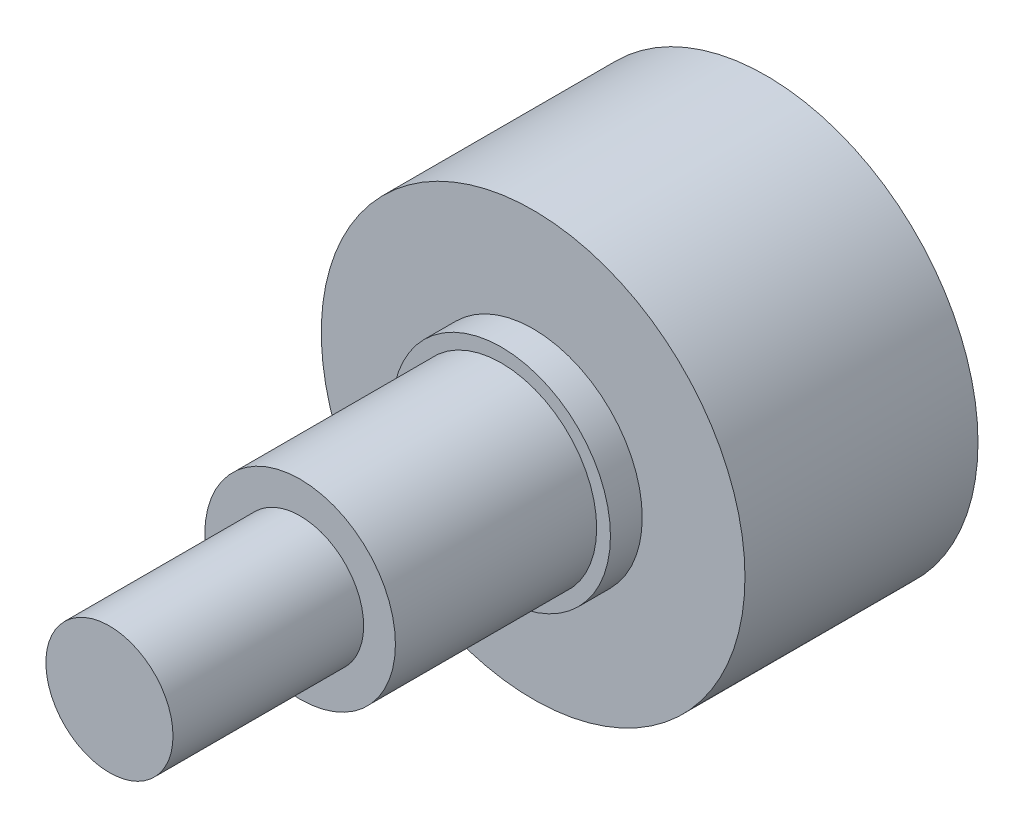
ISO-10303-21;
HEADER;
FILE_DESCRIPTION(('STEP AP214'),'2;1');
FILE_NAME('part.step','',(''),(''),'','','');
FILE_SCHEMA(('AUTOMOTIVE_DESIGN { 1 0 10303 214 1 1 1 1 }'));
ENDSEC;
DATA;
#1=APPLICATION_CONTEXT('core data for automotive mechanical design processes');
#2=APPLICATION_PROTOCOL_DEFINITION('international standard','automotive_design',2000,#1);
#3=PRODUCT_CONTEXT('',#1,'mechanical');
#4=PRODUCT('Part','Part','',(#3));
#5=PRODUCT_RELATED_PRODUCT_CATEGORY('part','',(#4));
#6=PRODUCT_DEFINITION_FORMATION('','',#4);
#7=PRODUCT_DEFINITION_CONTEXT('part definition',#1,'design');
#8=PRODUCT_DEFINITION('design','',#6,#7);
#9=PRODUCT_DEFINITION_SHAPE('','',#8);
#10=(LENGTH_UNIT() NAMED_UNIT(*) SI_UNIT(.MILLI.,.METRE.));
#11=(NAMED_UNIT(*) PLANE_ANGLE_UNIT() SI_UNIT($,.RADIAN.));
#12=(NAMED_UNIT(*) SI_UNIT($,.STERADIAN.) SOLID_ANGLE_UNIT());
#13=UNCERTAINTY_MEASURE_WITH_UNIT(LENGTH_MEASURE(1.E-05),#10,'distance_accuracy_value','');
#14=(GEOMETRIC_REPRESENTATION_CONTEXT(3) GLOBAL_UNCERTAINTY_ASSIGNED_CONTEXT((#13)) GLOBAL_UNIT_ASSIGNED_CONTEXT((#10,
#11,#12)) REPRESENTATION_CONTEXT('',''));
#15=CARTESIAN_POINT('',(0.,0.,0.));
#16=DIRECTION('',(0.,0.,1.));
#17=DIRECTION('',(1.,0.,0.));
#18=AXIS2_PLACEMENT_3D('',#15,#16,#17);
#19=CARTESIAN_POINT('',(0.,0.,11.));
#20=DIRECTION('',(0.,0.,-1.));
#21=DIRECTION('',(-1.,0.,0.));
#22=AXIS2_PLACEMENT_3D('',#19,#20,#21);
#23=CYLINDRICAL_SURFACE('',#22,10.);
#24=CARTESIAN_POINT('',(0.,0.,11.));
#25=DIRECTION('',(0.,0.,1.));
#26=DIRECTION('',(1.,0.,0.));
#27=AXIS2_PLACEMENT_3D('',#24,#25,#26);
#28=CIRCLE('',#27,10.);
#29=CARTESIAN_POINT('',(10.,0.,11.));
#30=VERTEX_POINT('',#29);
#31=EDGE_CURVE('E54',#30,#30,#28,.T.);
#32=ORIENTED_EDGE('',*,*,#31,.F.);
#33=EDGE_LOOP('',(#32));
#34=FACE_BOUND('',#33,.T.);
#35=CARTESIAN_POINT('',(0.,0.,0.));
#36=DIRECTION('',(0.,0.,1.));
#37=DIRECTION('',(1.,0.,0.));
#38=AXIS2_PLACEMENT_3D('',#35,#36,#37);
#39=CIRCLE('',#38,10.);
#40=CARTESIAN_POINT('',(10.,0.,0.));
#41=VERTEX_POINT('',#40);
#42=EDGE_CURVE('E33',#41,#41,#39,.T.);
#43=ORIENTED_EDGE('',*,*,#42,.T.);
#44=EDGE_LOOP('',(#43));
#45=FACE_BOUND('',#44,.T.);
#46=ADVANCED_FACE('F30',(#34,#45),#23,.T.);
#47=CARTESIAN_POINT('',(0.,0.,11.));
#48=DIRECTION('',(0.,0.,1.));
#49=DIRECTION('',(1.,0.,0.));
#50=AXIS2_PLACEMENT_3D('',#47,#48,#49);
#51=PLANE('',#50);
#52=CARTESIAN_POINT('',(0.,0.,11.));
#53=DIRECTION('',(0.,0.,1.));
#54=DIRECTION('',(1.,0.,0.));
#55=AXIS2_PLACEMENT_3D('',#52,#53,#54);
#56=CIRCLE('',#55,5.15);
#57=CARTESIAN_POINT('',(5.15,0.,11.));
#58=VERTEX_POINT('',#57);
#59=EDGE_CURVE('E42',#58,#58,#56,.T.);
#60=ORIENTED_EDGE('',*,*,#59,.F.);
#61=EDGE_LOOP('',(#60));
#62=FACE_BOUND('',#61,.T.);
#63=ORIENTED_EDGE('',*,*,#31,.T.);
#64=EDGE_LOOP('',(#63));
#65=FACE_BOUND('',#64,.T.);
#66=ADVANCED_FACE('F65',(#62,#65),#51,.T.);
#67=CARTESIAN_POINT('',(0.,0.,0.));
#68=DIRECTION('',(0.,0.,1.));
#69=DIRECTION('',(1.,0.,0.));
#70=AXIS2_PLACEMENT_3D('',#67,#68,#69);
#71=PLANE('',#70);
#72=ORIENTED_EDGE('',*,*,#42,.F.);
#73=EDGE_LOOP('',(#72));
#74=FACE_BOUND('',#73,.T.);
#75=ADVANCED_FACE('F62',(#74),#71,.F.);
#76=CARTESIAN_POINT('',(0.,0.,12.5));
#77=DIRECTION('',(0.,0.,-1.));
#78=DIRECTION('',(-1.,0.,0.));
#79=AXIS2_PLACEMENT_3D('',#76,#77,#78);
#80=CYLINDRICAL_SURFACE('',#79,5.15);
#81=CARTESIAN_POINT('',(0.,0.,12.5));
#82=DIRECTION('',(0.,0.,1.));
#83=DIRECTION('',(1.,0.,0.));
#84=AXIS2_PLACEMENT_3D('',#81,#82,#83);
#85=CIRCLE('',#84,5.15);
#86=CARTESIAN_POINT('',(5.15,0.,12.5));
#87=VERTEX_POINT('',#86);
#88=EDGE_CURVE('E49',#87,#87,#85,.T.);
#89=ORIENTED_EDGE('',*,*,#88,.F.);
#90=EDGE_LOOP('',(#89));
#91=FACE_BOUND('',#90,.T.);
#92=ORIENTED_EDGE('',*,*,#59,.T.);
#93=EDGE_LOOP('',(#92));
#94=FACE_BOUND('',#93,.T.);
#95=ADVANCED_FACE('F64',(#91,#94),#80,.T.);
#96=CARTESIAN_POINT('',(0.,0.,12.5));
#97=DIRECTION('',(0.,0.,1.));
#98=DIRECTION('',(1.,0.,0.));
#99=AXIS2_PLACEMENT_3D('',#96,#97,#98);
#100=PLANE('',#99);
#101=CARTESIAN_POINT('',(0.,0.,12.5));
#102=DIRECTION('',(0.,0.,1.));
#103=DIRECTION('',(1.,0.,0.));
#104=AXIS2_PLACEMENT_3D('',#101,#102,#103);
#105=CIRCLE('',#104,4.5);
#106=CARTESIAN_POINT('',(4.5,0.,12.5));
#107=VERTEX_POINT('',#106);
#108=EDGE_CURVE('E37',#107,#107,#105,.T.);
#109=ORIENTED_EDGE('',*,*,#108,.F.);
#110=EDGE_LOOP('',(#109));
#111=FACE_BOUND('',#110,.T.);
#112=ORIENTED_EDGE('',*,*,#88,.T.);
#113=EDGE_LOOP('',(#112));
#114=FACE_BOUND('',#113,.T.);
#115=ADVANCED_FACE('F70',(#111,#114),#100,.T.);
#116=CARTESIAN_POINT('',(0.,0.,22.));
#117=DIRECTION('',(0.,0.,-1.));
#118=DIRECTION('',(-1.,0.,0.));
#119=AXIS2_PLACEMENT_3D('',#116,#117,#118);
#120=CYLINDRICAL_SURFACE('',#119,4.5);
#121=CARTESIAN_POINT('',(0.,0.,22.));
#122=DIRECTION('',(0.,0.,1.));
#123=DIRECTION('',(1.,0.,0.));
#124=AXIS2_PLACEMENT_3D('',#121,#122,#123);
#125=CIRCLE('',#124,4.5);
#126=CARTESIAN_POINT('',(4.5,0.,22.));
#127=VERTEX_POINT('',#126);
#128=EDGE_CURVE('E47',#127,#127,#125,.T.);
#129=ORIENTED_EDGE('',*,*,#128,.F.);
#130=EDGE_LOOP('',(#129));
#131=FACE_BOUND('',#130,.T.);
#132=ORIENTED_EDGE('',*,*,#108,.T.);
#133=EDGE_LOOP('',(#132));
#134=FACE_BOUND('',#133,.T.);
#135=ADVANCED_FACE('F100',(#131,#134),#120,.T.);
#136=CARTESIAN_POINT('',(0.,0.,22.));
#137=DIRECTION('',(0.,0.,1.));
#138=DIRECTION('',(1.,0.,0.));
#139=AXIS2_PLACEMENT_3D('',#136,#137,#138);
#140=PLANE('',#139);
#141=CARTESIAN_POINT('',(0.,0.,22.));
#142=DIRECTION('',(0.,0.,1.));
#143=DIRECTION('',(1.,0.,0.));
#144=AXIS2_PLACEMENT_3D('',#141,#142,#143);
#145=CIRCLE('',#144,3.);
#146=CARTESIAN_POINT('',(3.,0.,22.));
#147=VERTEX_POINT('',#146);
#148=EDGE_CURVE('E10',#147,#147,#145,.T.);
#149=ORIENTED_EDGE('',*,*,#148,.F.);
#150=EDGE_LOOP('',(#149));
#151=FACE_BOUND('',#150,.T.);
#152=ORIENTED_EDGE('',*,*,#128,.T.);
#153=EDGE_LOOP('',(#152));
#154=FACE_BOUND('',#153,.T.);
#155=ADVANCED_FACE('F110',(#151,#154),#140,.T.);
#156=CARTESIAN_POINT('',(0.,0.,31.));
#157=DIRECTION('',(0.,0.,-1.));
#158=DIRECTION('',(-1.,0.,0.));
#159=AXIS2_PLACEMENT_3D('',#156,#157,#158);
#160=CYLINDRICAL_SURFACE('',#159,3.);
#161=CARTESIAN_POINT('',(0.,0.,31.));
#162=DIRECTION('',(0.,0.,1.));
#163=DIRECTION('',(1.,0.,0.));
#164=AXIS2_PLACEMENT_3D('',#161,#162,#163);
#165=CIRCLE('',#164,3.);
#166=CARTESIAN_POINT('',(3.,0.,31.));
#167=VERTEX_POINT('',#166);
#168=EDGE_CURVE('E46',#167,#167,#165,.T.);
#169=ORIENTED_EDGE('',*,*,#168,.F.);
#170=EDGE_LOOP('',(#169));
#171=FACE_BOUND('',#170,.T.);
#172=ORIENTED_EDGE('',*,*,#148,.T.);
#173=EDGE_LOOP('',(#172));
#174=FACE_BOUND('',#173,.T.);
#175=ADVANCED_FACE('F120',(#171,#174),#160,.T.);
#176=CARTESIAN_POINT('',(0.,0.,31.));
#177=DIRECTION('',(0.,0.,1.));
#178=DIRECTION('',(1.,0.,0.));
#179=AXIS2_PLACEMENT_3D('',#176,#177,#178);
#180=PLANE('',#179);
#181=ORIENTED_EDGE('',*,*,#168,.T.);
#182=EDGE_LOOP('',(#181));
#183=FACE_BOUND('',#182,.T.);
#184=ADVANCED_FACE('F130',(#183),#180,.T.);
#185=CLOSED_SHELL('',(#46,#66,#75,#95,#115,#135,#155,#175,#184));
#186=MANIFOLD_SOLID_BREP('B2',#185);
#187=ADVANCED_BREP_SHAPE_REPRESENTATION('',(#18,#186),#14);
#188=SHAPE_DEFINITION_REPRESENTATION(#9,#187);
ENDSEC;
END-ISO-10303-21;
